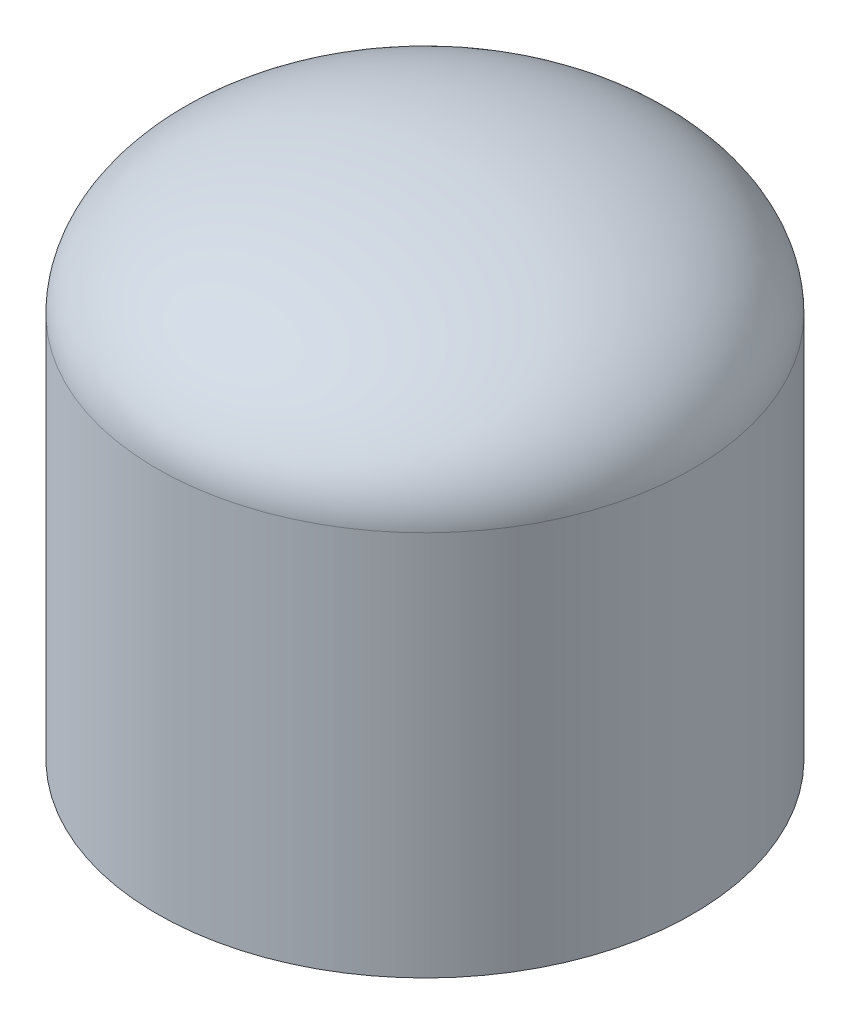
ISO-10303-21;
HEADER;
FILE_DESCRIPTION(('STEP AP214'),'2;1');
FILE_NAME('part.step','',(''),(''),'','','');
FILE_SCHEMA(('AUTOMOTIVE_DESIGN { 1 0 10303 214 1 1 1 1 }'));
ENDSEC;
DATA;
#1=APPLICATION_CONTEXT('core data for automotive mechanical design processes');
#2=APPLICATION_PROTOCOL_DEFINITION('international standard','automotive_design',2000,#1);
#3=PRODUCT_CONTEXT('',#1,'mechanical');
#4=PRODUCT('Part','Part','',(#3));
#5=PRODUCT_RELATED_PRODUCT_CATEGORY('part','',(#4));
#6=PRODUCT_DEFINITION_FORMATION('','',#4);
#7=PRODUCT_DEFINITION_CONTEXT('part definition',#1,'design');
#8=PRODUCT_DEFINITION('design','',#6,#7);
#9=PRODUCT_DEFINITION_SHAPE('','',#8);
#10=(LENGTH_UNIT() NAMED_UNIT(*) SI_UNIT(.MILLI.,.METRE.));
#11=(NAMED_UNIT(*) PLANE_ANGLE_UNIT() SI_UNIT($,.RADIAN.));
#12=(NAMED_UNIT(*) SI_UNIT($,.STERADIAN.) SOLID_ANGLE_UNIT());
#13=UNCERTAINTY_MEASURE_WITH_UNIT(LENGTH_MEASURE(1.E-05),#10,'distance_accuracy_value','');
#14=(GEOMETRIC_REPRESENTATION_CONTEXT(3) GLOBAL_UNCERTAINTY_ASSIGNED_CONTEXT((#13)) GLOBAL_UNIT_ASSIGNED_CONTEXT((#10,
#11,#12)) REPRESENTATION_CONTEXT('',''));
#15=CARTESIAN_POINT('',(0.,0.,0.));
#16=DIRECTION('',(0.,0.,1.));
#17=DIRECTION('',(1.,0.,0.));
#18=AXIS2_PLACEMENT_3D('',#15,#16,#17);
#19=CARTESIAN_POINT('',(0.,34.925,0.));
#20=DIRECTION('',(0.,0.,1.));
#21=DIRECTION('',(1.,0.,0.));
#22=AXIS2_PLACEMENT_3D('',#19,#20,#21);
#23=ELLIPSE('',#22,69.85,34.925);
#24=TRIMMED_CURVE('',#23,(PARAMETER_VALUE(1.5707963267949)),(PARAMETER_VALUE(4.71238898038469)),
.T.,.PARAMETER.);
#25=CARTESIAN_POINT('',(0.,69.85,0.));
#26=DIRECTION('',(0.,1.,0.));
#27=AXIS1_PLACEMENT('',#25,#26);
#28=SURFACE_OF_REVOLUTION('',#24,#27);
#29=CARTESIAN_POINT('',(0.,34.925,0.));
#30=DIRECTION('',(0.,1.,0.));
#31=DIRECTION('',(-1.,0.,0.));
#32=AXIS2_PLACEMENT_3D('',#29,#30,#31);
#33=CIRCLE('',#32,69.85);
#34=CARTESIAN_POINT('',(-69.85,34.925,0.));
#35=VERTEX_POINT('',#34);
#36=EDGE_CURVE('E44',#35,#35,#33,.T.);
#37=ORIENTED_EDGE('',*,*,#36,.T.);
#38=EDGE_LOOP('',(#37));
#39=FACE_BOUND('',#38,.T.);
#40=CARTESIAN_POINT('',(0.,69.85,0.));
#41=VERTEX_POINT('',#40);
#42=VERTEX_LOOP('',#41);
#43=FACE_BOUND('',#42,.T.);
#44=ADVANCED_FACE('F37',(#39,#43),#28,.F.);
#45=CARTESIAN_POINT('',(-69.85,-65.549018,0.));
#46=DIRECTION('',(0.,-1.,0.));
#47=DIRECTION('',(1.,0.,0.));
#48=AXIS2_PLACEMENT_3D('',#45,#46,#47);
#49=PLANE('',#48);
#50=CARTESIAN_POINT('',(0.,-65.549018,0.));
#51=DIRECTION('',(0.,1.,0.));
#52=DIRECTION('',(-1.,0.,0.));
#53=AXIS2_PLACEMENT_3D('',#50,#51,#52);
#54=CIRCLE('',#53,69.85);
#55=CARTESIAN_POINT('',(-69.85,-65.549018,0.));
#56=VERTEX_POINT('',#55);
#57=EDGE_CURVE('E11',#56,#56,#54,.T.);
#58=ORIENTED_EDGE('',*,*,#57,.F.);
#59=EDGE_LOOP('',(#58));
#60=FACE_BOUND('',#59,.T.);
#61=ADVANCED_FACE('F48',(#60),#49,.T.);
#62=CARTESIAN_POINT('',(0.,69.85,0.));
#63=DIRECTION('',(0.,1.,0.));
#64=DIRECTION('',(-1.,0.,0.));
#65=AXIS2_PLACEMENT_3D('',#62,#63,#64);
#66=CYLINDRICAL_SURFACE('',#65,69.85);
#67=ORIENTED_EDGE('',*,*,#57,.T.);
#68=EDGE_LOOP('',(#67));
#69=FACE_BOUND('',#68,.T.);
#70=ORIENTED_EDGE('',*,*,#36,.F.);
#71=EDGE_LOOP('',(#70));
#72=FACE_BOUND('',#71,.T.);
#73=ADVANCED_FACE('F53',(#69,#72),#66,.T.);
#74=CLOSED_SHELL('',(#44,#61,#73));
#75=MANIFOLD_SOLID_BREP('B2',#74);
#76=ADVANCED_BREP_SHAPE_REPRESENTATION('',(#18,#75),#14);
#77=SHAPE_DEFINITION_REPRESENTATION(#9,#76);
ENDSEC;
END-ISO-10303-21;
